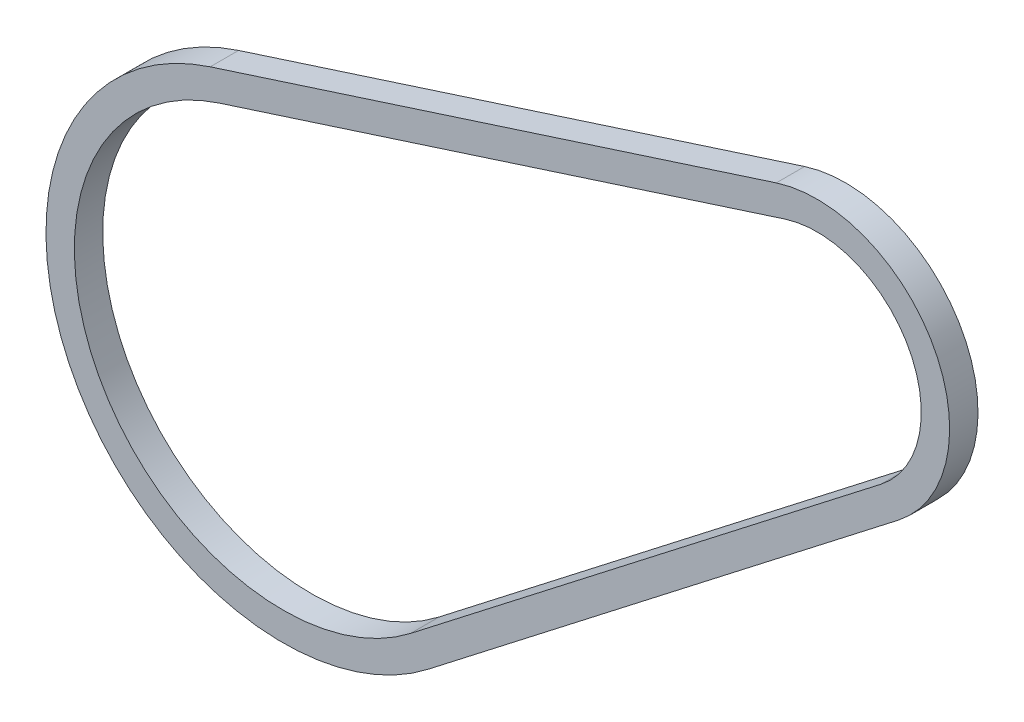
ISO-10303-21;
HEADER;
FILE_DESCRIPTION(('STEP AP214'),'2;1');
FILE_NAME('part.step','',(''),(''),'','','');
FILE_SCHEMA(('AUTOMOTIVE_DESIGN { 1 0 10303 214 1 1 1 1 }'));
ENDSEC;
DATA;
#1=APPLICATION_CONTEXT('core data for automotive mechanical design processes');
#2=APPLICATION_PROTOCOL_DEFINITION('international standard','automotive_design',2000,#1);
#3=PRODUCT_CONTEXT('',#1,'mechanical');
#4=PRODUCT('Part','Part','',(#3));
#5=PRODUCT_RELATED_PRODUCT_CATEGORY('part','',(#4));
#6=PRODUCT_DEFINITION_FORMATION('','',#4);
#7=PRODUCT_DEFINITION_CONTEXT('part definition',#1,'design');
#8=PRODUCT_DEFINITION('design','',#6,#7);
#9=PRODUCT_DEFINITION_SHAPE('','',#8);
#10=(LENGTH_UNIT() NAMED_UNIT(*) SI_UNIT(.MILLI.,.METRE.));
#11=(NAMED_UNIT(*) PLANE_ANGLE_UNIT() SI_UNIT($,.RADIAN.));
#12=(NAMED_UNIT(*) SI_UNIT($,.STERADIAN.) SOLID_ANGLE_UNIT());
#13=UNCERTAINTY_MEASURE_WITH_UNIT(LENGTH_MEASURE(1.E-05),#10,'distance_accuracy_value','');
#14=(GEOMETRIC_REPRESENTATION_CONTEXT(3) GLOBAL_UNCERTAINTY_ASSIGNED_CONTEXT((#13)) GLOBAL_UNIT_ASSIGNED_CONTEXT((#10,
#11,#12)) REPRESENTATION_CONTEXT('',''));
#15=CARTESIAN_POINT('',(0.,0.,0.));
#16=DIRECTION('',(0.,0.,1.));
#17=DIRECTION('',(1.,0.,0.));
#18=AXIS2_PLACEMENT_3D('',#15,#16,#17);
#19=CARTESIAN_POINT('',(2.01336082036697E-13,1.96432649299656E-12,5.));
#20=DIRECTION('',(0.,0.,-1.));
#21=DIRECTION('',(-1.,0.,0.));
#22=AXIS2_PLACEMENT_3D('',#19,#20,#21);
#23=PLANE('',#22);
#24=CARTESIAN_POINT('',(2.01336082036697E-13,1.96432649299656E-12,5.));
#25=DIRECTION('',(0.,0.,-1.));
#26=DIRECTION('',(-1.,0.,0.));
#27=AXIS2_PLACEMENT_3D('',#24,#25,#26);
#28=CIRCLE('',#27,83.5);
#29=CARTESIAN_POINT('',(-25.623428750887,79.4713149447555,4.99999999999999));
#30=VERTEX_POINT('',#29);
#31=CARTESIAN_POINT('',(51.1352490390666,-66.010880207072,4.99999999999999));
#32=VERTEX_POINT('',#31);
#33=EDGE_CURVE('E158',#30,#32,#28,.F.);
#34=ORIENTED_EDGE('',*,*,#33,.T.);
#35=DIRECTION('',(0.790549463557772,0.612398192084627,0.));
#36=VECTOR('',#35,1.);
#37=CARTESIAN_POINT('',(51.1352490390666,-66.010880207072,5.));
#38=LINE('',#37,#36);
#39=CARTESIAN_POINT('',(216.809413947664,62.3284125786744,4.99999999999999));
#40=VERTEX_POINT('',#39);
#41=EDGE_CURVE('E161',#32,#40,#38,.T.);
#42=ORIENTED_EDGE('',*,*,#41,.T.);
#43=CARTESIAN_POINT('',(188.179798467708,99.2866000000002,5.));
#44=DIRECTION('',(0.,0.,-1.));
#45=DIRECTION('',(-1.,0.,0.));
#46=AXIS2_PLACEMENT_3D('',#43,#44,#45);
#47=CIRCLE('',#46,46.75);
#48=CARTESIAN_POINT('',(173.833747041313,143.781018846314,5.));
#49=VERTEX_POINT('',#48);
#50=EDGE_CURVE('E164',#40,#49,#47,.F.);
#51=ORIENTED_EDGE('',*,*,#50,.T.);
#52=DIRECTION('',(-0.951752274787468,-0.306867410190266,0.));
#53=VECTOR('',#52,1.);
#54=CARTESIAN_POINT('',(-25.623428750887,79.4713149447555,5.));
#55=LINE('',#54,#53);
#56=EDGE_CURVE('E166',#49,#30,#55,.T.);
#57=ORIENTED_EDGE('',*,*,#56,.T.);
#58=EDGE_LOOP('',(#34,#42,#51,#57));
#59=FACE_BOUND('',#58,.T.);
#60=CARTESIAN_POINT('',(2.01336082036697E-13,1.96432649299656E-12,5.));
#61=DIRECTION('',(0.,0.,1.));
#62=DIRECTION('',(-1.,0.,0.));
#63=AXIS2_PLACEMENT_3D('',#60,#61,#62);
#64=CIRCLE('',#63,73.5);
#65=CARTESIAN_POINT('',(-22.5547546489844,69.9537921968808,5.));
#66=VERTEX_POINT('',#65);
#67=CARTESIAN_POINT('',(45.0112671182203,-58.1053855714942,5.));
#68=VERTEX_POINT('',#67);
#69=EDGE_CURVE('E122',#66,#68,#64,.T.);
#70=ORIENTED_EDGE('',*,*,#69,.F.);
#71=DIRECTION('',(-0.951752274787467,-0.306867410190266,0.));
#72=VECTOR('',#71,1.);
#73=CARTESIAN_POINT('',(-22.5547546489844,69.9537921968808,5.));
#74=LINE('',#73,#72);
#75=CARTESIAN_POINT('',(176.902421143216,134.26349609844,5.));
#76=VERTEX_POINT('',#75);
#77=EDGE_CURVE('E144',#76,#66,#74,.T.);
#78=ORIENTED_EDGE('',*,*,#77,.F.);
#79=CARTESIAN_POINT('',(188.179798467708,99.2866000000002,5.));
#80=DIRECTION('',(0.,0.,1.));
#81=DIRECTION('',(-1.,0.,0.));
#82=AXIS2_PLACEMENT_3D('',#79,#80,#81);
#83=CIRCLE('',#82,36.75);
#84=CARTESIAN_POINT('',(210.685432026818,70.2339072142521,5.));
#85=VERTEX_POINT('',#84);
#86=EDGE_CURVE('E142',#85,#76,#83,.T.);
#87=ORIENTED_EDGE('',*,*,#86,.F.);
#88=DIRECTION('',(0.790549463557771,0.612398192084627,0.));
#89=VECTOR('',#88,1.);
#90=CARTESIAN_POINT('',(210.685432026818,70.2339072142521,5.));
#91=LINE('',#90,#89);
#92=EDGE_CURVE('E130',#68,#85,#91,.T.);
#93=ORIENTED_EDGE('',*,*,#92,.F.);
#94=EDGE_LOOP('',(#70,#78,#87,#93));
#95=FACE_BOUND('',#94,.T.);
#96=ADVANCED_FACE('F57',(#59,#95),#23,.F.);
#97=CARTESIAN_POINT('',(2.01336082036697E-13,1.96432649299656E-12,-5.));
#98=DIRECTION('',(0.,0.,-1.));
#99=DIRECTION('',(-1.,0.,0.));
#100=AXIS2_PLACEMENT_3D('',#97,#98,#99);
#101=PLANE('',#100);
#102=CARTESIAN_POINT('',(2.01336082036697E-13,1.96432649299656E-12,-5.));
#103=DIRECTION('',(0.,0.,-1.));
#104=DIRECTION('',(-1.,0.,0.));
#105=AXIS2_PLACEMENT_3D('',#102,#103,#104);
#106=CIRCLE('',#105,83.5);
#107=CARTESIAN_POINT('',(-25.623428750887,79.4713149447555,-5.00000000000001));
#108=VERTEX_POINT('',#107);
#109=CARTESIAN_POINT('',(51.1352490390666,-66.010880207072,-5.00000000000001));
#110=VERTEX_POINT('',#109);
#111=EDGE_CURVE('E138',#108,#110,#106,.F.);
#112=ORIENTED_EDGE('',*,*,#111,.F.);
#113=DIRECTION('',(-0.951752274787468,-0.306867410190266,0.));
#114=VECTOR('',#113,1.);
#115=CARTESIAN_POINT('',(-25.623428750887,79.4713149447555,-5.));
#116=LINE('',#115,#114);
#117=CARTESIAN_POINT('',(173.833747041313,143.781018846314,-5.));
#118=VERTEX_POINT('',#117);
#119=EDGE_CURVE('E162',#118,#108,#116,.T.);
#120=ORIENTED_EDGE('',*,*,#119,.F.);
#121=CARTESIAN_POINT('',(188.179798467708,99.2866000000002,-5.));
#122=DIRECTION('',(0.,0.,-1.));
#123=DIRECTION('',(-1.,0.,0.));
#124=AXIS2_PLACEMENT_3D('',#121,#122,#123);
#125=CIRCLE('',#124,46.75);
#126=CARTESIAN_POINT('',(216.809413947664,62.3284125786744,-5.00000000000001));
#127=VERTEX_POINT('',#126);
#128=EDGE_CURVE('E173',#127,#118,#125,.F.);
#129=ORIENTED_EDGE('',*,*,#128,.F.);
#130=DIRECTION('',(0.790549463557772,0.612398192084627,0.));
#131=VECTOR('',#130,1.);
#132=CARTESIAN_POINT('',(51.1352490390666,-66.010880207072,-5.));
#133=LINE('',#132,#131);
#134=EDGE_CURVE('E171',#110,#127,#133,.T.);
#135=ORIENTED_EDGE('',*,*,#134,.F.);
#136=EDGE_LOOP('',(#112,#120,#129,#135));
#137=FACE_BOUND('',#136,.T.);
#138=DIRECTION('',(-0.951752274787467,-0.306867410190266,0.));
#139=VECTOR('',#138,1.);
#140=CARTESIAN_POINT('',(-22.5547546489844,69.9537921968808,-5.));
#141=LINE('',#140,#139);
#142=CARTESIAN_POINT('',(176.902421143216,134.26349609844,-5.));
#143=VERTEX_POINT('',#142);
#144=CARTESIAN_POINT('',(-22.5547546489844,69.9537921968808,-5.));
#145=VERTEX_POINT('',#144);
#146=EDGE_CURVE('E131',#143,#145,#141,.T.);
#147=ORIENTED_EDGE('',*,*,#146,.T.);
#148=CARTESIAN_POINT('',(2.01336082036697E-13,1.96432649299656E-12,-5.));
#149=DIRECTION('',(0.,0.,1.));
#150=DIRECTION('',(-1.,0.,0.));
#151=AXIS2_PLACEMENT_3D('',#148,#149,#150);
#152=CIRCLE('',#151,73.5);
#153=CARTESIAN_POINT('',(45.0112671182203,-58.1053855714942,-5.));
#154=VERTEX_POINT('',#153);
#155=EDGE_CURVE('E80',#145,#154,#152,.T.);
#156=ORIENTED_EDGE('',*,*,#155,.T.);
#157=DIRECTION('',(0.790549463557771,0.612398192084627,0.));
#158=VECTOR('',#157,1.);
#159=CARTESIAN_POINT('',(210.685432026818,70.2339072142521,-5.));
#160=LINE('',#159,#158);
#161=CARTESIAN_POINT('',(210.685432026818,70.2339072142521,-5.));
#162=VERTEX_POINT('',#161);
#163=EDGE_CURVE('E137',#154,#162,#160,.T.);
#164=ORIENTED_EDGE('',*,*,#163,.T.);
#165=CARTESIAN_POINT('',(188.179798467708,99.2866000000002,-5.));
#166=DIRECTION('',(0.,0.,1.));
#167=DIRECTION('',(-1.,0.,0.));
#168=AXIS2_PLACEMENT_3D('',#165,#166,#167);
#169=CIRCLE('',#168,36.75);
#170=EDGE_CURVE('E150',#162,#143,#169,.T.);
#171=ORIENTED_EDGE('',*,*,#170,.T.);
#172=EDGE_LOOP('',(#147,#156,#164,#171));
#173=FACE_BOUND('',#172,.T.);
#174=ADVANCED_FACE('F191',(#137,#173),#101,.T.);
#175=CARTESIAN_POINT('',(2.01336082036697E-13,1.96432649299656E-12,5.));
#176=DIRECTION('',(0.,0.,-1.));
#177=DIRECTION('',(-1.,0.,0.));
#178=AXIS2_PLACEMENT_3D('',#175,#176,#177);
#179=CYLINDRICAL_SURFACE('',#178,83.5);
#180=ORIENTED_EDGE('',*,*,#111,.T.);
#181=DIRECTION('',(0.,0.,-1.));
#182=VECTOR('',#181,1.);
#183=CARTESIAN_POINT('',(51.1352490390666,-66.010880207072,4.99999999999999));
#184=LINE('',#183,#182);
#185=EDGE_CURVE('E12',#32,#110,#184,.T.);
#186=ORIENTED_EDGE('',*,*,#185,.F.);
#187=ORIENTED_EDGE('',*,*,#33,.F.);
#188=DIRECTION('',(0.,0.,-1.));
#189=VECTOR('',#188,1.);
#190=CARTESIAN_POINT('',(-25.623428750887,79.4713149447555,4.99999999999999));
#191=LINE('',#190,#189);
#192=EDGE_CURVE('E168',#30,#108,#191,.T.);
#193=ORIENTED_EDGE('',*,*,#192,.T.);
#194=EDGE_LOOP('',(#180,#186,#187,#193));
#195=FACE_BOUND('',#194,.T.);
#196=ADVANCED_FACE('F59',(#195),#179,.T.);
#197=CARTESIAN_POINT('',(51.1352490390666,-66.010880207072,5.));
#198=DIRECTION('',(-0.612398192084627,0.790549463557772,0.));
#199=DIRECTION('',(-0.790549463557772,-0.612398192084627,0.));
#200=AXIS2_PLACEMENT_3D('',#197,#198,#199);
#201=PLANE('',#200);
#202=ORIENTED_EDGE('',*,*,#134,.T.);
#203=DIRECTION('',(0.,0.,-1.));
#204=VECTOR('',#203,1.);
#205=CARTESIAN_POINT('',(216.809413947664,62.3284125786744,4.99999999999999));
#206=LINE('',#205,#204);
#207=EDGE_CURVE('E65',#40,#127,#206,.T.);
#208=ORIENTED_EDGE('',*,*,#207,.F.);
#209=ORIENTED_EDGE('',*,*,#41,.F.);
#210=ORIENTED_EDGE('',*,*,#185,.T.);
#211=EDGE_LOOP('',(#202,#208,#209,#210));
#212=FACE_BOUND('',#211,.T.);
#213=ADVANCED_FACE('F201',(#212),#201,.F.);
#214=CARTESIAN_POINT('',(188.179798467708,99.2866000000002,5.));
#215=DIRECTION('',(0.,0.,-1.));
#216=DIRECTION('',(-1.,0.,0.));
#217=AXIS2_PLACEMENT_3D('',#214,#215,#216);
#218=CYLINDRICAL_SURFACE('',#217,46.75);
#219=ORIENTED_EDGE('',*,*,#128,.T.);
#220=DIRECTION('',(0.,0.,-1.));
#221=VECTOR('',#220,1.);
#222=CARTESIAN_POINT('',(173.833747041313,143.781018846314,5.));
#223=LINE('',#222,#221);
#224=EDGE_CURVE('E178',#49,#118,#223,.T.);
#225=ORIENTED_EDGE('',*,*,#224,.F.);
#226=ORIENTED_EDGE('',*,*,#50,.F.);
#227=ORIENTED_EDGE('',*,*,#207,.T.);
#228=EDGE_LOOP('',(#219,#225,#226,#227));
#229=FACE_BOUND('',#228,.T.);
#230=ADVANCED_FACE('F185',(#229),#218,.T.);
#231=CARTESIAN_POINT('',(-25.623428750887,79.4713149447555,5.));
#232=DIRECTION('',(0.306867410190266,-0.951752274787467,0.));
#233=DIRECTION('',(0.951752274787467,0.306867410190266,0.));
#234=AXIS2_PLACEMENT_3D('',#231,#232,#233);
#235=PLANE('',#234);
#236=ORIENTED_EDGE('',*,*,#119,.T.);
#237=ORIENTED_EDGE('',*,*,#192,.F.);
#238=ORIENTED_EDGE('',*,*,#56,.F.);
#239=ORIENTED_EDGE('',*,*,#224,.T.);
#240=EDGE_LOOP('',(#236,#237,#238,#239));
#241=FACE_BOUND('',#240,.T.);
#242=ADVANCED_FACE('F195',(#241),#235,.F.);
#243=CARTESIAN_POINT('',(2.01336082036697E-13,1.96432649299656E-12,5.));
#244=DIRECTION('',(0.,0.,-1.));
#245=DIRECTION('',(-1.,0.,0.));
#246=AXIS2_PLACEMENT_3D('',#243,#244,#245);
#247=CYLINDRICAL_SURFACE('',#246,73.5);
#248=ORIENTED_EDGE('',*,*,#155,.F.);
#249=DIRECTION('',(0.,0.,-1.));
#250=VECTOR('',#249,1.);
#251=CARTESIAN_POINT('',(-22.5547546489844,69.9537921968808,5.));
#252=LINE('',#251,#250);
#253=EDGE_CURVE('E126',#66,#145,#252,.T.);
#254=ORIENTED_EDGE('',*,*,#253,.F.);
#255=ORIENTED_EDGE('',*,*,#69,.T.);
#256=DIRECTION('',(0.,0.,-1.));
#257=VECTOR('',#256,1.);
#258=CARTESIAN_POINT('',(45.0112671182203,-58.1053855714942,5.));
#259=LINE('',#258,#257);
#260=EDGE_CURVE('E125',#68,#154,#259,.T.);
#261=ORIENTED_EDGE('',*,*,#260,.T.);
#262=EDGE_LOOP('',(#248,#254,#255,#261));
#263=FACE_BOUND('',#262,.T.);
#264=ADVANCED_FACE('F124',(#263),#247,.F.);
#265=CARTESIAN_POINT('',(210.685432026818,70.2339072142521,5.));
#266=DIRECTION('',(-0.612398192084627,0.790549463557772,0.));
#267=DIRECTION('',(-0.790549463557772,-0.612398192084627,0.));
#268=AXIS2_PLACEMENT_3D('',#265,#266,#267);
#269=PLANE('',#268);
#270=ORIENTED_EDGE('',*,*,#163,.F.);
#271=ORIENTED_EDGE('',*,*,#260,.F.);
#272=ORIENTED_EDGE('',*,*,#92,.T.);
#273=DIRECTION('',(0.,0.,-1.));
#274=VECTOR('',#273,1.);
#275=CARTESIAN_POINT('',(210.685432026818,70.2339072142521,5.));
#276=LINE('',#275,#274);
#277=EDGE_CURVE('E139',#85,#162,#276,.T.);
#278=ORIENTED_EDGE('',*,*,#277,.T.);
#279=EDGE_LOOP('',(#270,#271,#272,#278));
#280=FACE_BOUND('',#279,.T.);
#281=ADVANCED_FACE('F134',(#280),#269,.T.);
#282=CARTESIAN_POINT('',(188.179798467708,99.2866000000002,5.));
#283=DIRECTION('',(0.,0.,-1.));
#284=DIRECTION('',(-1.,0.,0.));
#285=AXIS2_PLACEMENT_3D('',#282,#283,#284);
#286=CYLINDRICAL_SURFACE('',#285,36.75);
#287=ORIENTED_EDGE('',*,*,#170,.F.);
#288=ORIENTED_EDGE('',*,*,#277,.F.);
#289=ORIENTED_EDGE('',*,*,#86,.T.);
#290=DIRECTION('',(0.,0.,-1.));
#291=VECTOR('',#290,1.);
#292=CARTESIAN_POINT('',(176.902421143216,134.26349609844,5.));
#293=LINE('',#292,#291);
#294=EDGE_CURVE('E72',#76,#143,#293,.T.);
#295=ORIENTED_EDGE('',*,*,#294,.T.);
#296=EDGE_LOOP('',(#287,#288,#289,#295));
#297=FACE_BOUND('',#296,.T.);
#298=ADVANCED_FACE('F224',(#297),#286,.F.);
#299=CARTESIAN_POINT('',(-22.5547546489844,69.9537921968808,5.));
#300=DIRECTION('',(0.306867410190266,-0.951752274787467,0.));
#301=DIRECTION('',(0.951752274787468,0.306867410190266,0.));
#302=AXIS2_PLACEMENT_3D('',#299,#300,#301);
#303=PLANE('',#302);
#304=ORIENTED_EDGE('',*,*,#146,.F.);
#305=ORIENTED_EDGE('',*,*,#294,.F.);
#306=ORIENTED_EDGE('',*,*,#77,.T.);
#307=ORIENTED_EDGE('',*,*,#253,.T.);
#308=EDGE_LOOP('',(#304,#305,#306,#307));
#309=FACE_BOUND('',#308,.T.);
#310=ADVANCED_FACE('F228',(#309),#303,.T.);
#311=CLOSED_SHELL('',(#96,#174,#196,#213,#230,#242,#264,#281,#298,#310));
#312=MANIFOLD_SOLID_BREP('B2',#311);
#313=ADVANCED_BREP_SHAPE_REPRESENTATION('',(#18,#312),#14);
#314=SHAPE_DEFINITION_REPRESENTATION(#9,#313);
ENDSEC;
END-ISO-10303-21;
